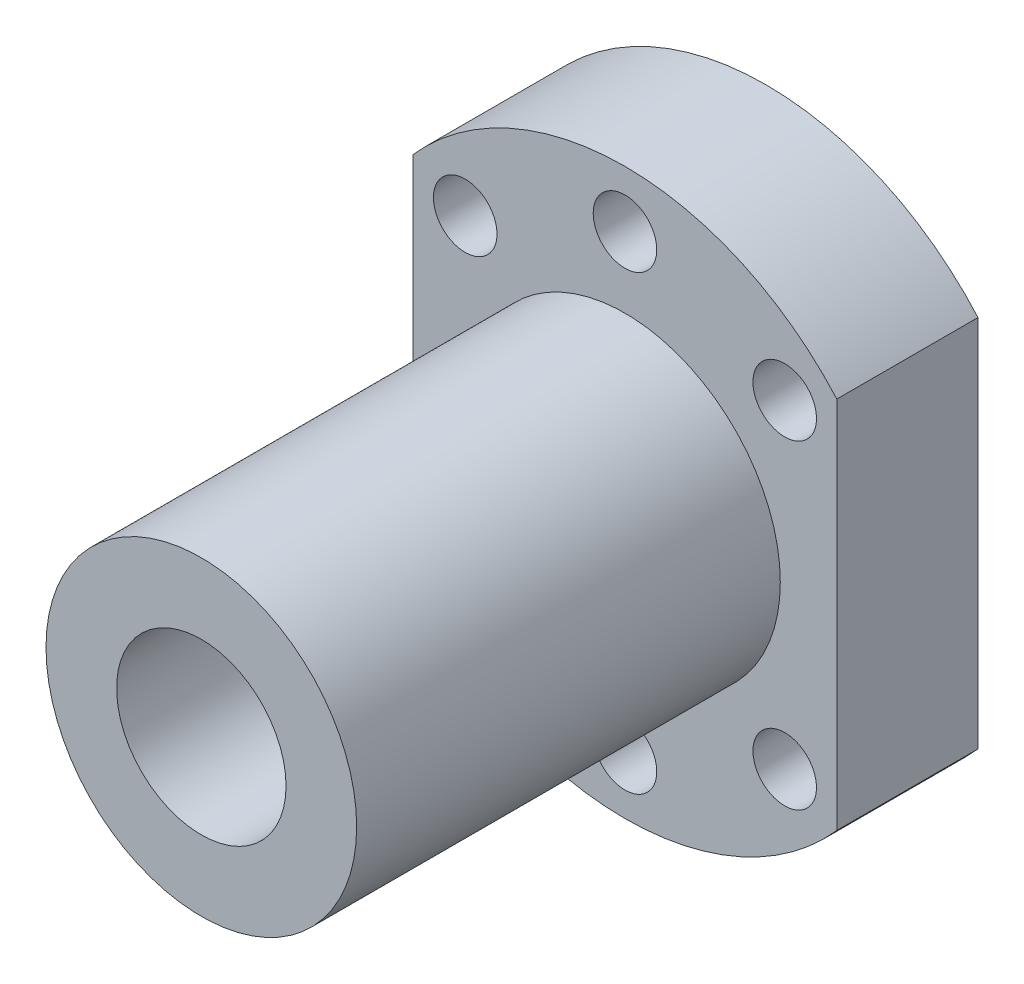
ISO-10303-21;
HEADER;
FILE_DESCRIPTION(('STEP AP214'),'2;1');
FILE_NAME('part.step','',(''),(''),'','','');
FILE_SCHEMA(('AUTOMOTIVE_DESIGN { 1 0 10303 214 1 1 1 1 }'));
ENDSEC;
DATA;
#1=APPLICATION_CONTEXT('core data for automotive mechanical design processes');
#2=APPLICATION_PROTOCOL_DEFINITION('international standard','automotive_design',2000,#1);
#3=PRODUCT_CONTEXT('',#1,'mechanical');
#4=PRODUCT('Part','Part','',(#3));
#5=PRODUCT_RELATED_PRODUCT_CATEGORY('part','',(#4));
#6=PRODUCT_DEFINITION_FORMATION('','',#4);
#7=PRODUCT_DEFINITION_CONTEXT('part definition',#1,'design');
#8=PRODUCT_DEFINITION('design','',#6,#7);
#9=PRODUCT_DEFINITION_SHAPE('','',#8);
#10=(LENGTH_UNIT() NAMED_UNIT(*) SI_UNIT(.MILLI.,.METRE.));
#11=(NAMED_UNIT(*) PLANE_ANGLE_UNIT() SI_UNIT($,.RADIAN.));
#12=(NAMED_UNIT(*) SI_UNIT($,.STERADIAN.) SOLID_ANGLE_UNIT());
#13=UNCERTAINTY_MEASURE_WITH_UNIT(LENGTH_MEASURE(1.E-05),#10,'distance_accuracy_value','');
#14=(GEOMETRIC_REPRESENTATION_CONTEXT(3) GLOBAL_UNCERTAINTY_ASSIGNED_CONTEXT((#13)) GLOBAL_UNIT_ASSIGNED_CONTEXT((#10,
#11,#12)) REPRESENTATION_CONTEXT('',''));
#15=CARTESIAN_POINT('',(0.,0.,0.));
#16=DIRECTION('',(0.,0.,1.));
#17=DIRECTION('',(1.,0.,0.));
#18=AXIS2_PLACEMENT_3D('',#15,#16,#17);
#19=CARTESIAN_POINT('',(0.,0.,10.));
#20=DIRECTION('',(0.,0.,-1.));
#21=DIRECTION('',(-1.,0.,0.));
#22=AXIS2_PLACEMENT_3D('',#19,#20,#21);
#23=CYLINDRICAL_SURFACE('',#22,20.);
#24=CARTESIAN_POINT('',(0.,0.,0.));
#25=DIRECTION('',(0.,0.,1.));
#26=DIRECTION('',(-1.,0.,0.));
#27=AXIS2_PLACEMENT_3D('',#24,#25,#26);
#28=CIRCLE('',#27,20.);
#29=CARTESIAN_POINT('',(15.,13.228756555323,0.));
#30=VERTEX_POINT('',#29);
#31=CARTESIAN_POINT('',(-15.,13.228756555323,0.));
#32=VERTEX_POINT('',#31);
#33=EDGE_CURVE('E95',#30,#32,#28,.T.);
#34=ORIENTED_EDGE('',*,*,#33,.T.);
#35=DIRECTION('',(0.,0.,-1.));
#36=VECTOR('',#35,1.);
#37=CARTESIAN_POINT('',(-15.,13.228756555323,10.));
#38=LINE('',#37,#36);
#39=CARTESIAN_POINT('',(-15.,13.228756555323,10.));
#40=VERTEX_POINT('',#39);
#41=EDGE_CURVE('E11',#40,#32,#38,.T.);
#42=ORIENTED_EDGE('',*,*,#41,.F.);
#43=CARTESIAN_POINT('',(0.,0.,10.));
#44=DIRECTION('',(0.,0.,1.));
#45=DIRECTION('',(-1.,0.,0.));
#46=AXIS2_PLACEMENT_3D('',#43,#44,#45);
#47=CIRCLE('',#46,20.);
#48=CARTESIAN_POINT('',(15.,13.228756555323,10.));
#49=VERTEX_POINT('',#48);
#50=EDGE_CURVE('E83',#49,#40,#47,.T.);
#51=ORIENTED_EDGE('',*,*,#50,.F.);
#52=DIRECTION('',(0.,0.,-1.));
#53=VECTOR('',#52,1.);
#54=CARTESIAN_POINT('',(15.,13.228756555323,10.));
#55=LINE('',#54,#53);
#56=EDGE_CURVE('E91',#49,#30,#55,.T.);
#57=ORIENTED_EDGE('',*,*,#56,.T.);
#58=EDGE_LOOP('',(#34,#42,#51,#57));
#59=FACE_BOUND('',#58,.T.);
#60=ADVANCED_FACE('F32',(#59),#23,.T.);
#61=CARTESIAN_POINT('',(-15.,13.228756555323,10.));
#62=DIRECTION('',(1.,0.,0.));
#63=DIRECTION('',(0.,0.,-1.));
#64=AXIS2_PLACEMENT_3D('',#61,#62,#63);
#65=PLANE('',#64);
#66=DIRECTION('',(0.,-1.,0.));
#67=VECTOR('',#66,1.);
#68=CARTESIAN_POINT('',(-15.,13.228756555323,0.));
#69=LINE('',#68,#67);
#70=CARTESIAN_POINT('',(-15.,-13.228756555323,0.));
#71=VERTEX_POINT('',#70);
#72=EDGE_CURVE('E87',#32,#71,#69,.T.);
#73=ORIENTED_EDGE('',*,*,#72,.T.);
#74=DIRECTION('',(0.,0.,-1.));
#75=VECTOR('',#74,1.);
#76=CARTESIAN_POINT('',(-15.,-13.228756555323,10.));
#77=LINE('',#76,#75);
#78=CARTESIAN_POINT('',(-15.,-13.228756555323,10.));
#79=VERTEX_POINT('',#78);
#80=EDGE_CURVE('E40',#79,#71,#77,.T.);
#81=ORIENTED_EDGE('',*,*,#80,.F.);
#82=DIRECTION('',(0.,-1.,0.));
#83=VECTOR('',#82,1.);
#84=CARTESIAN_POINT('',(-15.,13.228756555323,10.));
#85=LINE('',#84,#83);
#86=EDGE_CURVE('E78',#40,#79,#85,.T.);
#87=ORIENTED_EDGE('',*,*,#86,.F.);
#88=ORIENTED_EDGE('',*,*,#41,.T.);
#89=EDGE_LOOP('',(#73,#81,#87,#88));
#90=FACE_BOUND('',#89,.T.);
#91=ADVANCED_FACE('F86',(#90),#65,.F.);
#92=CARTESIAN_POINT('',(0.,0.,10.));
#93=DIRECTION('',(0.,0.,-1.));
#94=DIRECTION('',(-1.,0.,0.));
#95=AXIS2_PLACEMENT_3D('',#92,#93,#94);
#96=CYLINDRICAL_SURFACE('',#95,20.);
#97=CARTESIAN_POINT('',(0.,0.,0.));
#98=DIRECTION('',(0.,0.,1.));
#99=DIRECTION('',(1.,0.,0.));
#100=AXIS2_PLACEMENT_3D('',#97,#98,#99);
#101=CIRCLE('',#100,20.);
#102=CARTESIAN_POINT('',(15.,-13.2287565553229,0.));
#103=VERTEX_POINT('',#102);
#104=EDGE_CURVE('E65',#71,#103,#101,.T.);
#105=ORIENTED_EDGE('',*,*,#104,.T.);
#106=DIRECTION('',(0.,0.,-1.));
#107=VECTOR('',#106,1.);
#108=CARTESIAN_POINT('',(15.,-13.2287565553229,10.));
#109=LINE('',#108,#107);
#110=CARTESIAN_POINT('',(15.,-13.2287565553229,10.));
#111=VERTEX_POINT('',#110);
#112=EDGE_CURVE('E88',#111,#103,#109,.T.);
#113=ORIENTED_EDGE('',*,*,#112,.F.);
#114=CARTESIAN_POINT('',(0.,0.,10.));
#115=DIRECTION('',(0.,0.,1.));
#116=DIRECTION('',(1.,0.,0.));
#117=AXIS2_PLACEMENT_3D('',#114,#115,#116);
#118=CIRCLE('',#117,20.);
#119=EDGE_CURVE('E81',#79,#111,#118,.T.);
#120=ORIENTED_EDGE('',*,*,#119,.F.);
#121=ORIENTED_EDGE('',*,*,#80,.T.);
#122=EDGE_LOOP('',(#105,#113,#120,#121));
#123=FACE_BOUND('',#122,.T.);
#124=ADVANCED_FACE('F89',(#123),#96,.T.);
#125=CARTESIAN_POINT('',(15.,13.228756555323,10.));
#126=DIRECTION('',(-1.,0.,0.));
#127=DIRECTION('',(0.,0.,1.));
#128=AXIS2_PLACEMENT_3D('',#125,#126,#127);
#129=PLANE('',#128);
#130=DIRECTION('',(0.,1.,0.));
#131=VECTOR('',#130,1.);
#132=CARTESIAN_POINT('',(15.,13.228756555323,0.));
#133=LINE('',#132,#131);
#134=EDGE_CURVE('E71',#103,#30,#133,.T.);
#135=ORIENTED_EDGE('',*,*,#134,.T.);
#136=ORIENTED_EDGE('',*,*,#56,.F.);
#137=DIRECTION('',(0.,1.,0.));
#138=VECTOR('',#137,1.);
#139=CARTESIAN_POINT('',(15.,13.228756555323,10.));
#140=LINE('',#139,#138);
#141=EDGE_CURVE('E48',#111,#49,#140,.T.);
#142=ORIENTED_EDGE('',*,*,#141,.F.);
#143=ORIENTED_EDGE('',*,*,#112,.T.);
#144=EDGE_LOOP('',(#135,#136,#142,#143));
#145=FACE_BOUND('',#144,.T.);
#146=ADVANCED_FACE('F103',(#145),#129,.F.);
#147=CARTESIAN_POINT('',(0.,0.,10.));
#148=DIRECTION('',(0.,0.,-1.));
#149=DIRECTION('',(-1.,0.,0.));
#150=AXIS2_PLACEMENT_3D('',#147,#148,#149);
#151=PLANE('',#150);
#152=CARTESIAN_POINT('',(-11.3137084989847,-11.3137084989848,10.));
#153=DIRECTION('',(0.,0.,-1.));
#154=DIRECTION('',(-1.,0.,0.));
#155=AXIS2_PLACEMENT_3D('',#152,#153,#154);
#156=CIRCLE('',#155,2.25);
#157=CARTESIAN_POINT('',(-13.5637084989847,-11.3137084989848,10.));
#158=VERTEX_POINT('',#157);
#159=EDGE_CURVE('E150',#158,#158,#156,.F.);
#160=ORIENTED_EDGE('',*,*,#159,.F.);
#161=EDGE_LOOP('',(#160));
#162=FACE_BOUND('',#161,.T.);
#163=CARTESIAN_POINT('',(0.,-16.,10.));
#164=DIRECTION('',(0.,0.,-1.));
#165=DIRECTION('',(-1.,0.,0.));
#166=AXIS2_PLACEMENT_3D('',#163,#164,#165);
#167=CIRCLE('',#166,2.25);
#168=CARTESIAN_POINT('',(-2.25,-16.,10.));
#169=VERTEX_POINT('',#168);
#170=EDGE_CURVE('E144',#169,#169,#167,.F.);
#171=ORIENTED_EDGE('',*,*,#170,.F.);
#172=EDGE_LOOP('',(#171));
#173=FACE_BOUND('',#172,.T.);
#174=CARTESIAN_POINT('',(11.3137084989847,-11.3137084989848,10.));
#175=DIRECTION('',(0.,0.,-1.));
#176=DIRECTION('',(-1.,0.,0.));
#177=AXIS2_PLACEMENT_3D('',#174,#175,#176);
#178=CIRCLE('',#177,2.25);
#179=CARTESIAN_POINT('',(9.0637084989847,-11.3137084989848,10.));
#180=VERTEX_POINT('',#179);
#181=EDGE_CURVE('E138',#180,#180,#178,.F.);
#182=ORIENTED_EDGE('',*,*,#181,.F.);
#183=EDGE_LOOP('',(#182));
#184=FACE_BOUND('',#183,.T.);
#185=CARTESIAN_POINT('',(-11.3137084989847,11.3137084989848,10.));
#186=DIRECTION('',(0.,0.,-1.));
#187=DIRECTION('',(-1.,0.,0.));
#188=AXIS2_PLACEMENT_3D('',#185,#186,#187);
#189=CIRCLE('',#188,2.25);
#190=CARTESIAN_POINT('',(-13.5637084989847,11.3137084989848,10.));
#191=VERTEX_POINT('',#190);
#192=EDGE_CURVE('E132',#191,#191,#189,.T.);
#193=ORIENTED_EDGE('',*,*,#192,.T.);
#194=EDGE_LOOP('',(#193));
#195=FACE_BOUND('',#194,.T.);
#196=CARTESIAN_POINT('',(0.,16.,10.));
#197=DIRECTION('',(0.,0.,-1.));
#198=DIRECTION('',(-1.,0.,0.));
#199=AXIS2_PLACEMENT_3D('',#196,#197,#198);
#200=CIRCLE('',#199,2.25);
#201=CARTESIAN_POINT('',(-2.25,16.,10.));
#202=VERTEX_POINT('',#201);
#203=EDGE_CURVE('E126',#202,#202,#200,.T.);
#204=ORIENTED_EDGE('',*,*,#203,.T.);
#205=EDGE_LOOP('',(#204));
#206=FACE_BOUND('',#205,.T.);
#207=CARTESIAN_POINT('',(11.3137084989847,11.3137084989848,10.));
#208=DIRECTION('',(0.,0.,-1.));
#209=DIRECTION('',(-1.,0.,0.));
#210=AXIS2_PLACEMENT_3D('',#207,#208,#209);
#211=CIRCLE('',#210,2.25);
#212=CARTESIAN_POINT('',(9.0637084989847,11.3137084989848,10.));
#213=VERTEX_POINT('',#212);
#214=EDGE_CURVE('E118',#213,#213,#211,.T.);
#215=ORIENTED_EDGE('',*,*,#214,.T.);
#216=EDGE_LOOP('',(#215));
#217=FACE_BOUND('',#216,.T.);
#218=CARTESIAN_POINT('',(0.,0.,10.));
#219=DIRECTION('',(0.,0.,-1.));
#220=DIRECTION('',(-1.,0.,0.));
#221=AXIS2_PLACEMENT_3D('',#218,#219,#220);
#222=CIRCLE('',#221,11.);
#223=CARTESIAN_POINT('',(-11.,0.,10.));
#224=VERTEX_POINT('',#223);
#225=EDGE_CURVE('E98',#224,#224,#222,.T.);
#226=ORIENTED_EDGE('',*,*,#225,.T.);
#227=EDGE_LOOP('',(#226));
#228=FACE_BOUND('',#227,.T.);
#229=ORIENTED_EDGE('',*,*,#50,.T.);
#230=ORIENTED_EDGE('',*,*,#86,.T.);
#231=ORIENTED_EDGE('',*,*,#119,.T.);
#232=ORIENTED_EDGE('',*,*,#141,.T.);
#233=EDGE_LOOP('',(#229,#230,#231,#232));
#234=FACE_BOUND('',#233,.T.);
#235=ADVANCED_FACE('F79',(#162,#173,#184,#195,#206,#217,#228,#234),#151,.F.);
#236=CARTESIAN_POINT('',(0.,0.,0.));
#237=DIRECTION('',(0.,0.,-1.));
#238=DIRECTION('',(-1.,0.,0.));
#239=AXIS2_PLACEMENT_3D('',#236,#237,#238);
#240=PLANE('',#239);
#241=CARTESIAN_POINT('',(-11.3137084989847,-11.3137084989848,0.));
#242=DIRECTION('',(0.,0.,1.));
#243=DIRECTION('',(-1.,0.,0.));
#244=AXIS2_PLACEMENT_3D('',#241,#242,#243);
#245=CIRCLE('',#244,2.25);
#246=CARTESIAN_POINT('',(-13.5637084989847,-11.3137084989848,0.));
#247=VERTEX_POINT('',#246);
#248=EDGE_CURVE('E153',#247,#247,#245,.T.);
#249=ORIENTED_EDGE('',*,*,#248,.T.);
#250=EDGE_LOOP('',(#249));
#251=FACE_BOUND('',#250,.T.);
#252=CARTESIAN_POINT('',(0.,-16.,0.));
#253=DIRECTION('',(0.,0.,1.));
#254=DIRECTION('',(-1.,0.,0.));
#255=AXIS2_PLACEMENT_3D('',#252,#253,#254);
#256=CIRCLE('',#255,2.25);
#257=CARTESIAN_POINT('',(-2.25,-16.,0.));
#258=VERTEX_POINT('',#257);
#259=EDGE_CURVE('E147',#258,#258,#256,.T.);
#260=ORIENTED_EDGE('',*,*,#259,.T.);
#261=EDGE_LOOP('',(#260));
#262=FACE_BOUND('',#261,.T.);
#263=CARTESIAN_POINT('',(11.3137084989847,-11.3137084989848,0.));
#264=DIRECTION('',(0.,0.,1.));
#265=DIRECTION('',(-1.,0.,0.));
#266=AXIS2_PLACEMENT_3D('',#263,#264,#265);
#267=CIRCLE('',#266,2.25);
#268=CARTESIAN_POINT('',(9.0637084989847,-11.3137084989848,0.));
#269=VERTEX_POINT('',#268);
#270=EDGE_CURVE('E141',#269,#269,#267,.T.);
#271=ORIENTED_EDGE('',*,*,#270,.T.);
#272=EDGE_LOOP('',(#271));
#273=FACE_BOUND('',#272,.T.);
#274=CARTESIAN_POINT('',(-11.3137084989847,11.3137084989848,0.));
#275=DIRECTION('',(0.,0.,-1.));
#276=DIRECTION('',(-1.,0.,0.));
#277=AXIS2_PLACEMENT_3D('',#274,#275,#276);
#278=CIRCLE('',#277,2.25);
#279=CARTESIAN_POINT('',(-13.5637084989847,11.3137084989848,0.));
#280=VERTEX_POINT('',#279);
#281=EDGE_CURVE('E135',#280,#280,#278,.T.);
#282=ORIENTED_EDGE('',*,*,#281,.F.);
#283=EDGE_LOOP('',(#282));
#284=FACE_BOUND('',#283,.T.);
#285=CARTESIAN_POINT('',(0.,16.,0.));
#286=DIRECTION('',(0.,0.,-1.));
#287=DIRECTION('',(-1.,0.,0.));
#288=AXIS2_PLACEMENT_3D('',#285,#286,#287);
#289=CIRCLE('',#288,2.25);
#290=CARTESIAN_POINT('',(-2.25,16.,0.));
#291=VERTEX_POINT('',#290);
#292=EDGE_CURVE('E129',#291,#291,#289,.T.);
#293=ORIENTED_EDGE('',*,*,#292,.F.);
#294=EDGE_LOOP('',(#293));
#295=FACE_BOUND('',#294,.T.);
#296=CARTESIAN_POINT('',(11.3137084989847,11.3137084989848,0.));
#297=DIRECTION('',(0.,0.,-1.));
#298=DIRECTION('',(-1.,0.,0.));
#299=AXIS2_PLACEMENT_3D('',#296,#297,#298);
#300=CIRCLE('',#299,2.25);
#301=CARTESIAN_POINT('',(9.0637084989847,11.3137084989848,0.));
#302=VERTEX_POINT('',#301);
#303=EDGE_CURVE('E123',#302,#302,#300,.T.);
#304=ORIENTED_EDGE('',*,*,#303,.F.);
#305=EDGE_LOOP('',(#304));
#306=FACE_BOUND('',#305,.T.);
#307=CARTESIAN_POINT('',(0.,0.,0.));
#308=DIRECTION('',(0.,0.,1.));
#309=DIRECTION('',(1.,0.,0.));
#310=AXIS2_PLACEMENT_3D('',#307,#308,#309);
#311=CIRCLE('',#310,6.);
#312=CARTESIAN_POINT('',(6.,0.,0.));
#313=VERTEX_POINT('',#312);
#314=EDGE_CURVE('E114',#313,#313,#311,.T.);
#315=ORIENTED_EDGE('',*,*,#314,.T.);
#316=EDGE_LOOP('',(#315));
#317=FACE_BOUND('',#316,.T.);
#318=ORIENTED_EDGE('',*,*,#33,.F.);
#319=ORIENTED_EDGE('',*,*,#134,.F.);
#320=ORIENTED_EDGE('',*,*,#104,.F.);
#321=ORIENTED_EDGE('',*,*,#72,.F.);
#322=EDGE_LOOP('',(#318,#319,#320,#321));
#323=FACE_BOUND('',#322,.T.);
#324=ADVANCED_FACE('F106',(#251,#262,#273,#284,#295,#306,#317,#323),#240,.T.);
#325=CARTESIAN_POINT('',(0.,0.,40.));
#326=DIRECTION('',(0.,0.,-1.));
#327=DIRECTION('',(-1.,0.,0.));
#328=AXIS2_PLACEMENT_3D('',#325,#326,#327);
#329=CYLINDRICAL_SURFACE('',#328,11.);
#330=CARTESIAN_POINT('',(0.,0.,40.));
#331=DIRECTION('',(0.,0.,-1.));
#332=DIRECTION('',(-1.,0.,0.));
#333=AXIS2_PLACEMENT_3D('',#330,#331,#332);
#334=CIRCLE('',#333,11.);
#335=CARTESIAN_POINT('',(-11.,0.,40.));
#336=VERTEX_POINT('',#335);
#337=EDGE_CURVE('E111',#336,#336,#334,.T.);
#338=ORIENTED_EDGE('',*,*,#337,.T.);
#339=EDGE_LOOP('',(#338));
#340=FACE_BOUND('',#339,.T.);
#341=ORIENTED_EDGE('',*,*,#225,.F.);
#342=EDGE_LOOP('',(#341));
#343=FACE_BOUND('',#342,.T.);
#344=ADVANCED_FACE('F181',(#340,#343),#329,.T.);
#345=CARTESIAN_POINT('',(0.,0.,40.));
#346=DIRECTION('',(0.,0.,-1.));
#347=DIRECTION('',(-1.,0.,0.));
#348=AXIS2_PLACEMENT_3D('',#345,#346,#347);
#349=PLANE('',#348);
#350=CARTESIAN_POINT('',(0.,0.,40.));
#351=DIRECTION('',(0.,0.,1.));
#352=DIRECTION('',(1.,0.,0.));
#353=AXIS2_PLACEMENT_3D('',#350,#351,#352);
#354=CIRCLE('',#353,6.);
#355=CARTESIAN_POINT('',(6.,0.,40.));
#356=VERTEX_POINT('',#355);
#357=EDGE_CURVE('E115',#356,#356,#354,.T.);
#358=ORIENTED_EDGE('',*,*,#357,.F.);
#359=EDGE_LOOP('',(#358));
#360=FACE_BOUND('',#359,.T.);
#361=ORIENTED_EDGE('',*,*,#337,.F.);
#362=EDGE_LOOP('',(#361));
#363=FACE_BOUND('',#362,.T.);
#364=ADVANCED_FACE('F183',(#360,#363),#349,.F.);
#365=CARTESIAN_POINT('',(0.,0.,0.));
#366=DIRECTION('',(0.,0.,1.));
#367=DIRECTION('',(1.,0.,0.));
#368=AXIS2_PLACEMENT_3D('',#365,#366,#367);
#369=CYLINDRICAL_SURFACE('',#368,6.);
#370=ORIENTED_EDGE('',*,*,#314,.F.);
#371=EDGE_LOOP('',(#370));
#372=FACE_BOUND('',#371,.T.);
#373=ORIENTED_EDGE('',*,*,#357,.T.);
#374=EDGE_LOOP('',(#373));
#375=FACE_BOUND('',#374,.T.);
#376=ADVANCED_FACE('F190',(#372,#375),#369,.F.);
#377=CARTESIAN_POINT('',(11.3137084989847,11.3137084989848,40.));
#378=DIRECTION('',(0.,0.,-1.));
#379=DIRECTION('',(-1.,0.,0.));
#380=AXIS2_PLACEMENT_3D('',#377,#378,#379);
#381=CYLINDRICAL_SURFACE('',#380,2.25);
#382=ORIENTED_EDGE('',*,*,#303,.T.);
#383=EDGE_LOOP('',(#382));
#384=FACE_BOUND('',#383,.T.);
#385=ORIENTED_EDGE('',*,*,#214,.F.);
#386=EDGE_LOOP('',(#385));
#387=FACE_BOUND('',#386,.T.);
#388=ADVANCED_FACE('F258',(#384,#387),#381,.F.);
#389=CARTESIAN_POINT('',(0.,16.,40.));
#390=DIRECTION('',(0.,0.,-1.));
#391=DIRECTION('',(-1.,0.,0.));
#392=AXIS2_PLACEMENT_3D('',#389,#390,#391);
#393=CYLINDRICAL_SURFACE('',#392,2.25);
#394=ORIENTED_EDGE('',*,*,#292,.T.);
#395=EDGE_LOOP('',(#394));
#396=FACE_BOUND('',#395,.T.);
#397=ORIENTED_EDGE('',*,*,#203,.F.);
#398=EDGE_LOOP('',(#397));
#399=FACE_BOUND('',#398,.T.);
#400=ADVANCED_FACE('F254',(#396,#399),#393,.F.);
#401=CARTESIAN_POINT('',(-11.3137084989847,11.3137084989848,40.));
#402=DIRECTION('',(0.,0.,-1.));
#403=DIRECTION('',(-1.,0.,0.));
#404=AXIS2_PLACEMENT_3D('',#401,#402,#403);
#405=CYLINDRICAL_SURFACE('',#404,2.25);
#406=ORIENTED_EDGE('',*,*,#281,.T.);
#407=EDGE_LOOP('',(#406));
#408=FACE_BOUND('',#407,.T.);
#409=ORIENTED_EDGE('',*,*,#192,.F.);
#410=EDGE_LOOP('',(#409));
#411=FACE_BOUND('',#410,.T.);
#412=ADVANCED_FACE('F228',(#408,#411),#405,.F.);
#413=CARTESIAN_POINT('',(11.3137084989847,-11.3137084989848,40.));
#414=DIRECTION('',(0.,0.,-1.));
#415=DIRECTION('',(-1.,0.,0.));
#416=AXIS2_PLACEMENT_3D('',#413,#414,#415);
#417=CYLINDRICAL_SURFACE('',#416,2.25);
#418=ORIENTED_EDGE('',*,*,#270,.F.);
#419=EDGE_LOOP('',(#418));
#420=FACE_BOUND('',#419,.T.);
#421=ORIENTED_EDGE('',*,*,#181,.T.);
#422=EDGE_LOOP('',(#421));
#423=FACE_BOUND('',#422,.T.);
#424=ADVANCED_FACE('F223',(#420,#423),#417,.F.);
#425=CARTESIAN_POINT('',(0.,-16.,40.));
#426=DIRECTION('',(0.,0.,-1.));
#427=DIRECTION('',(-1.,0.,0.));
#428=AXIS2_PLACEMENT_3D('',#425,#426,#427);
#429=CYLINDRICAL_SURFACE('',#428,2.25);
#430=ORIENTED_EDGE('',*,*,#259,.F.);
#431=EDGE_LOOP('',(#430));
#432=FACE_BOUND('',#431,.T.);
#433=ORIENTED_EDGE('',*,*,#170,.T.);
#434=EDGE_LOOP('',(#433));
#435=FACE_BOUND('',#434,.T.);
#436=ADVANCED_FACE('F162',(#432,#435),#429,.F.);
#437=CARTESIAN_POINT('',(-11.3137084989847,-11.3137084989848,40.));
#438=DIRECTION('',(0.,0.,-1.));
#439=DIRECTION('',(-1.,0.,0.));
#440=AXIS2_PLACEMENT_3D('',#437,#438,#439);
#441=CYLINDRICAL_SURFACE('',#440,2.25);
#442=ORIENTED_EDGE('',*,*,#248,.F.);
#443=EDGE_LOOP('',(#442));
#444=FACE_BOUND('',#443,.T.);
#445=ORIENTED_EDGE('',*,*,#159,.T.);
#446=EDGE_LOOP('',(#445));
#447=FACE_BOUND('',#446,.T.);
#448=ADVANCED_FACE('F159',(#444,#447),#441,.F.);
#449=CLOSED_SHELL('',(#60,#91,#124,#146,#235,#324,#344,#364,#376,#388,#400,#412,#424,#436,#448));
#450=MANIFOLD_SOLID_BREP('B2',#449);
#451=ADVANCED_BREP_SHAPE_REPRESENTATION('',(#18,#450),#14);
#452=SHAPE_DEFINITION_REPRESENTATION(#9,#451);
ENDSEC;
END-ISO-10303-21;
